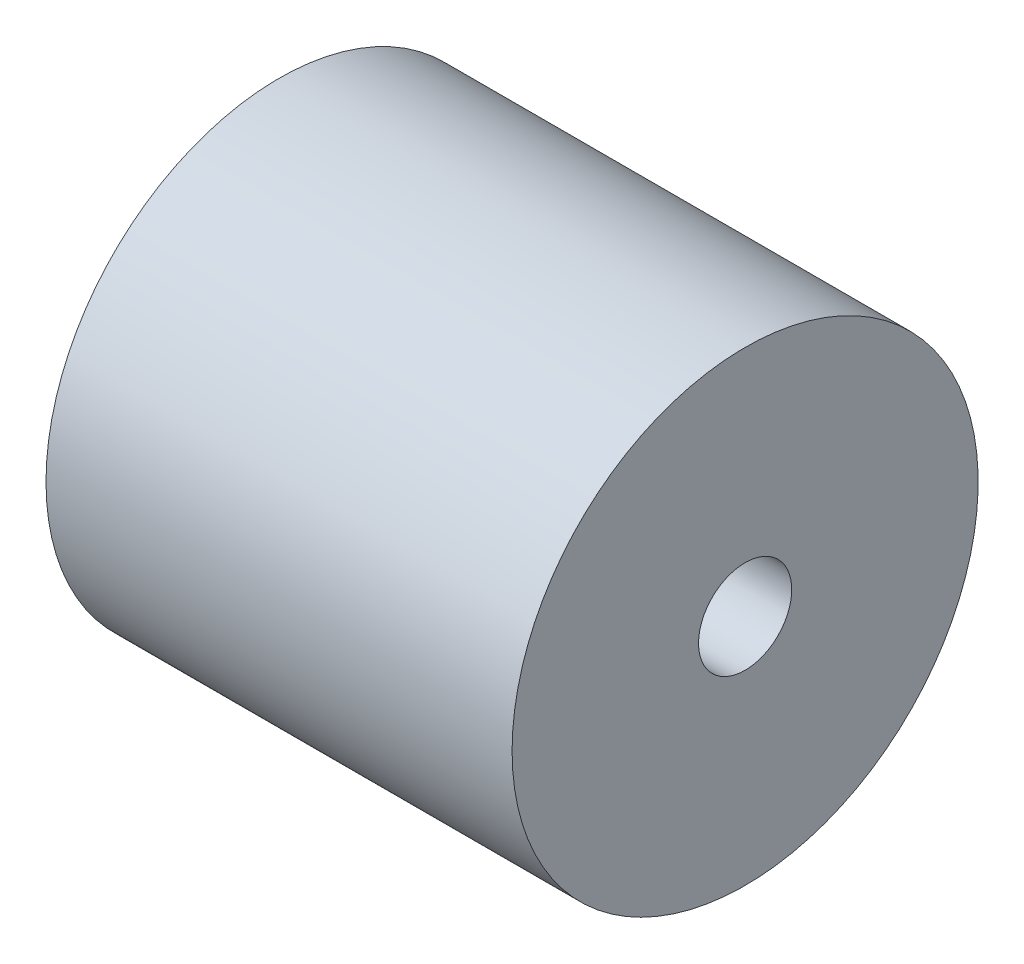
ISO-10303-21;
HEADER;
FILE_DESCRIPTION(('STEP AP214'),'2;1');
FILE_NAME('part.step','',(''),(''),'','','');
FILE_SCHEMA(('AUTOMOTIVE_DESIGN { 1 0 10303 214 1 1 1 1 }'));
ENDSEC;
DATA;
#1=APPLICATION_CONTEXT('core data for automotive mechanical design processes');
#2=APPLICATION_PROTOCOL_DEFINITION('international standard','automotive_design',2000,#1);
#3=PRODUCT_CONTEXT('',#1,'mechanical');
#4=PRODUCT('Part','Part','',(#3));
#5=PRODUCT_RELATED_PRODUCT_CATEGORY('part','',(#4));
#6=PRODUCT_DEFINITION_FORMATION('','',#4);
#7=PRODUCT_DEFINITION_CONTEXT('part definition',#1,'design');
#8=PRODUCT_DEFINITION('design','',#6,#7);
#9=PRODUCT_DEFINITION_SHAPE('','',#8);
#10=(LENGTH_UNIT() NAMED_UNIT(*) SI_UNIT(.MILLI.,.METRE.));
#11=(NAMED_UNIT(*) PLANE_ANGLE_UNIT() SI_UNIT($,.RADIAN.));
#12=(NAMED_UNIT(*) SI_UNIT($,.STERADIAN.) SOLID_ANGLE_UNIT());
#13=UNCERTAINTY_MEASURE_WITH_UNIT(LENGTH_MEASURE(1.E-05),#10,'distance_accuracy_value','');
#14=(GEOMETRIC_REPRESENTATION_CONTEXT(3) GLOBAL_UNCERTAINTY_ASSIGNED_CONTEXT((#13)) GLOBAL_UNIT_ASSIGNED_CONTEXT((#10,
#11,#12)) REPRESENTATION_CONTEXT('',''));
#15=CARTESIAN_POINT('',(0.,0.,0.));
#16=DIRECTION('',(0.,0.,1.));
#17=DIRECTION('',(1.,0.,0.));
#18=AXIS2_PLACEMENT_3D('',#15,#16,#17);
#19=CARTESIAN_POINT('',(63.5,6.35,0.));
#20=DIRECTION('',(-1.,0.,0.));
#21=DIRECTION('',(0.,0.,1.));
#22=AXIS2_PLACEMENT_3D('',#19,#20,#21);
#23=PLANE('',#22);
#24=CARTESIAN_POINT('',(63.5,0.,0.));
#25=DIRECTION('',(-1.,0.,0.));
#26=DIRECTION('',(0.,0.,1.));
#27=AXIS2_PLACEMENT_3D('',#24,#25,#26);
#28=CIRCLE('',#27,31.75);
#29=CARTESIAN_POINT('',(63.5,0.,31.75));
#30=VERTEX_POINT('',#29);
#31=EDGE_CURVE('E44',#30,#30,#28,.T.);
#32=ORIENTED_EDGE('',*,*,#31,.F.);
#33=EDGE_LOOP('',(#32));
#34=FACE_BOUND('',#33,.T.);
#35=CARTESIAN_POINT('',(63.5,0.,0.));
#36=DIRECTION('',(-1.,0.,0.));
#37=DIRECTION('',(0.,0.,1.));
#38=AXIS2_PLACEMENT_3D('',#35,#36,#37);
#39=CIRCLE('',#38,6.35);
#40=CARTESIAN_POINT('',(63.5,0.,6.35));
#41=VERTEX_POINT('',#40);
#42=EDGE_CURVE('E10',#41,#41,#39,.T.);
#43=ORIENTED_EDGE('',*,*,#42,.T.);
#44=EDGE_LOOP('',(#43));
#45=FACE_BOUND('',#44,.T.);
#46=ADVANCED_FACE('F30',(#34,#45),#23,.F.);
#47=CARTESIAN_POINT('',(63.5,0.,0.));
#48=DIRECTION('',(-1.,0.,0.));
#49=DIRECTION('',(0.,0.,1.));
#50=AXIS2_PLACEMENT_3D('',#47,#48,#49);
#51=CYLINDRICAL_SURFACE('',#50,6.35);
#52=ORIENTED_EDGE('',*,*,#42,.F.);
#53=EDGE_LOOP('',(#52));
#54=FACE_BOUND('',#53,.T.);
#55=CARTESIAN_POINT('',(0.,0.,0.));
#56=DIRECTION('',(-1.,0.,0.));
#57=DIRECTION('',(0.,0.,1.));
#58=AXIS2_PLACEMENT_3D('',#55,#56,#57);
#59=CIRCLE('',#58,6.34999999999999);
#60=CARTESIAN_POINT('',(0.,0.,6.34999999999999));
#61=VERTEX_POINT('',#60);
#62=EDGE_CURVE('E36',#61,#61,#59,.T.);
#63=ORIENTED_EDGE('',*,*,#62,.T.);
#64=EDGE_LOOP('',(#63));
#65=FACE_BOUND('',#64,.T.);
#66=ADVANCED_FACE('F53',(#54,#65),#51,.F.);
#67=CARTESIAN_POINT('',(0.,6.34999999999999,0.));
#68=DIRECTION('',(1.,0.,0.));
#69=DIRECTION('',(0.,0.,-1.));
#70=AXIS2_PLACEMENT_3D('',#67,#68,#69);
#71=PLANE('',#70);
#72=ORIENTED_EDGE('',*,*,#62,.F.);
#73=EDGE_LOOP('',(#72));
#74=FACE_BOUND('',#73,.T.);
#75=CARTESIAN_POINT('',(0.,0.,0.));
#76=DIRECTION('',(-1.,0.,0.));
#77=DIRECTION('',(0.,0.,1.));
#78=AXIS2_PLACEMENT_3D('',#75,#76,#77);
#79=CIRCLE('',#78,31.75);
#80=CARTESIAN_POINT('',(0.,0.,31.75));
#81=VERTEX_POINT('',#80);
#82=EDGE_CURVE('E40',#81,#81,#79,.T.);
#83=ORIENTED_EDGE('',*,*,#82,.T.);
#84=EDGE_LOOP('',(#83));
#85=FACE_BOUND('',#84,.T.);
#86=ADVANCED_FACE('F57',(#74,#85),#71,.F.);
#87=CARTESIAN_POINT('',(63.5,0.,0.));
#88=DIRECTION('',(-1.,0.,0.));
#89=DIRECTION('',(0.,0.,1.));
#90=AXIS2_PLACEMENT_3D('',#87,#88,#89);
#91=CYLINDRICAL_SURFACE('',#90,31.75);
#92=ORIENTED_EDGE('',*,*,#82,.F.);
#93=EDGE_LOOP('',(#92));
#94=FACE_BOUND('',#93,.T.);
#95=ORIENTED_EDGE('',*,*,#31,.T.);
#96=EDGE_LOOP('',(#95));
#97=FACE_BOUND('',#96,.T.);
#98=ADVANCED_FACE('F50',(#94,#97),#91,.T.);
#99=CLOSED_SHELL('',(#46,#66,#86,#98));
#100=MANIFOLD_SOLID_BREP('B2',#99);
#101=ADVANCED_BREP_SHAPE_REPRESENTATION('',(#18,#100),#14);
#102=SHAPE_DEFINITION_REPRESENTATION(#9,#101);
ENDSEC;
END-ISO-10303-21;
